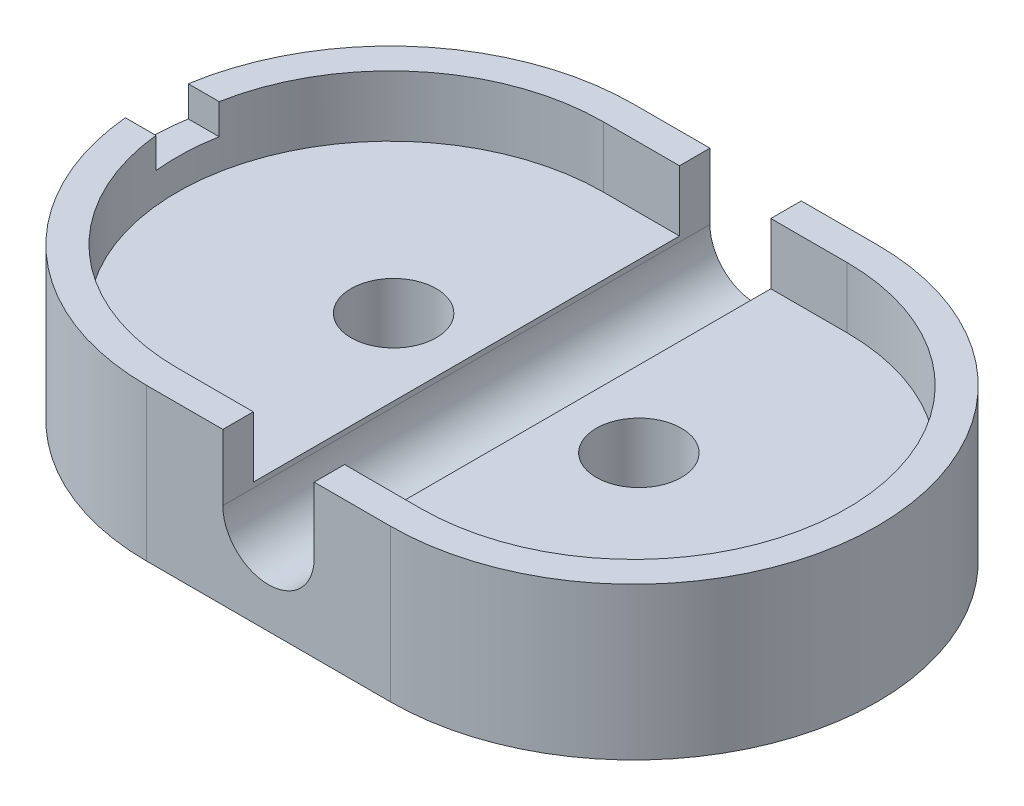
ISO-10303-21;
HEADER;
FILE_DESCRIPTION(('STEP AP214'),'2;1');
FILE_NAME('part.step','',(''),(''),'','','');
FILE_SCHEMA(('AUTOMOTIVE_DESIGN { 1 0 10303 214 1 1 1 1 }'));
ENDSEC;
DATA;
#1=APPLICATION_CONTEXT('core data for automotive mechanical design processes');
#2=APPLICATION_PROTOCOL_DEFINITION('international standard','automotive_design',2000,#1);
#3=PRODUCT_CONTEXT('',#1,'mechanical');
#4=PRODUCT('Part','Part','',(#3));
#5=PRODUCT_RELATED_PRODUCT_CATEGORY('part','',(#4));
#6=PRODUCT_DEFINITION_FORMATION('','',#4);
#7=PRODUCT_DEFINITION_CONTEXT('part definition',#1,'design');
#8=PRODUCT_DEFINITION('design','',#6,#7);
#9=PRODUCT_DEFINITION_SHAPE('','',#8);
#10=(LENGTH_UNIT() NAMED_UNIT(*) SI_UNIT(.MILLI.,.METRE.));
#11=(NAMED_UNIT(*) PLANE_ANGLE_UNIT() SI_UNIT($,.RADIAN.));
#12=(NAMED_UNIT(*) SI_UNIT($,.STERADIAN.) SOLID_ANGLE_UNIT());
#13=UNCERTAINTY_MEASURE_WITH_UNIT(LENGTH_MEASURE(1.E-05),#10,'distance_accuracy_value','');
#14=(GEOMETRIC_REPRESENTATION_CONTEXT(3) GLOBAL_UNCERTAINTY_ASSIGNED_CONTEXT((#13)) GLOBAL_UNIT_ASSIGNED_CONTEXT((#10,
#11,#12)) REPRESENTATION_CONTEXT('',''));
#15=CARTESIAN_POINT('',(0.,0.,0.));
#16=DIRECTION('',(0.,0.,1.));
#17=DIRECTION('',(1.,0.,0.));
#18=AXIS2_PLACEMENT_3D('',#15,#16,#17);
#19=CARTESIAN_POINT('',(0.,25.,-40.));
#20=DIRECTION('',(0.,1.,0.));
#21=DIRECTION('',(0.,0.,1.));
#22=AXIS2_PLACEMENT_3D('',#19,#20,#21);
#23=PLANE('',#22);
#24=DIRECTION('',(1.,0.,0.));
#25=VECTOR('',#24,1.);
#26=CARTESIAN_POINT('',(-40.,25.,-46.3231162941203));
#27=LINE('',#26,#25);
#28=CARTESIAN_POINT('',(-39.4970657179876,25.,-46.3231162941203));
#29=VERTEX_POINT('',#28);
#30=CARTESIAN_POINT('',(-34.4240933116768,25.,-46.3231162941203));
#31=VERTEX_POINT('',#30);
#32=EDGE_CURVE('E181',#29,#31,#27,.T.);
#33=ORIENTED_EDGE('',*,*,#32,.T.);
#34=CARTESIAN_POINT('',(0.,25.,-40.));
#35=DIRECTION('',(0.,1.,0.));
#36=DIRECTION('',(0.,0.,1.));
#37=AXIS2_PLACEMENT_3D('',#34,#35,#36);
#38=CIRCLE('',#37,35.);
#39=CARTESIAN_POINT('',(0.,25.,-75.));
#40=VERTEX_POINT('',#39);
#41=EDGE_CURVE('E296',#40,#31,#38,.T.);
#42=ORIENTED_EDGE('',*,*,#41,.F.);
#43=DIRECTION('',(-1.,0.,0.));
#44=VECTOR('',#43,1.);
#45=CARTESIAN_POINT('',(12.5,25.,-75.));
#46=LINE('',#45,#44);
#47=CARTESIAN_POINT('',(12.5,25.,-75.));
#48=VERTEX_POINT('',#47);
#49=EDGE_CURVE('E275',#48,#40,#46,.T.);
#50=ORIENTED_EDGE('',*,*,#49,.F.);
#51=DIRECTION('',(0.,0.,1.));
#52=VECTOR('',#51,1.);
#53=CARTESIAN_POINT('',(12.5,25.,-80.));
#54=LINE('',#53,#52);
#55=CARTESIAN_POINT('',(12.5,25.,-80.));
#56=VERTEX_POINT('',#55);
#57=EDGE_CURVE('E206',#56,#48,#54,.T.);
#58=ORIENTED_EDGE('',*,*,#57,.F.);
#59=DIRECTION('',(-1.,0.,0.));
#60=VECTOR('',#59,1.);
#61=CARTESIAN_POINT('',(40.,25.,-80.));
#62=LINE('',#61,#60);
#63=CARTESIAN_POINT('',(0.,25.,-80.));
#64=VERTEX_POINT('',#63);
#65=EDGE_CURVE('E212',#56,#64,#62,.T.);
#66=ORIENTED_EDGE('',*,*,#65,.T.);
#67=CARTESIAN_POINT('',(0.,25.,-40.));
#68=DIRECTION('',(0.,1.,0.));
#69=DIRECTION('',(0.,0.,1.));
#70=AXIS2_PLACEMENT_3D('',#67,#68,#69);
#71=CIRCLE('',#70,40.);
#72=EDGE_CURVE('E197',#64,#29,#71,.T.);
#73=ORIENTED_EDGE('',*,*,#72,.T.);
#74=EDGE_LOOP('',(#33,#42,#50,#58,#66,#73));
#75=FACE_BOUND('',#74,.T.);
#76=ADVANCED_FACE('F36',(#75),#23,.T.);
#77=DIRECTION('',(-1.,0.,0.));
#78=VECTOR('',#77,1.);
#79=CARTESIAN_POINT('',(27.5,25.,-75.));
#80=LINE('',#79,#78);
#81=CARTESIAN_POINT('',(40.,25.,-75.));
#82=VERTEX_POINT('',#81);
#83=CARTESIAN_POINT('',(27.5,25.,-75.));
#84=VERTEX_POINT('',#83);
#85=EDGE_CURVE('E259',#82,#84,#80,.T.);
#86=ORIENTED_EDGE('',*,*,#85,.F.);
#87=CARTESIAN_POINT('',(40.,25.,-40.));
#88=DIRECTION('',(0.,1.,0.));
#89=DIRECTION('',(0.,0.,-1.));
#90=AXIS2_PLACEMENT_3D('',#87,#88,#89);
#91=CIRCLE('',#90,35.);
#92=CARTESIAN_POINT('',(40.,25.,-4.99999999999999));
#93=VERTEX_POINT('',#92);
#94=EDGE_CURVE('E268',#93,#82,#91,.T.);
#95=ORIENTED_EDGE('',*,*,#94,.F.);
#96=DIRECTION('',(1.,0.,0.));
#97=VECTOR('',#96,1.);
#98=CARTESIAN_POINT('',(40.,25.,-5.));
#99=LINE('',#98,#97);
#100=CARTESIAN_POINT('',(27.5,25.,-5.));
#101=VERTEX_POINT('',#100);
#102=EDGE_CURVE('E255',#101,#93,#99,.T.);
#103=ORIENTED_EDGE('',*,*,#102,.F.);
#104=DIRECTION('',(0.,0.,1.));
#105=VECTOR('',#104,1.);
#106=CARTESIAN_POINT('',(27.5,25.,-80.));
#107=LINE('',#106,#105);
#108=CARTESIAN_POINT('',(27.5,25.,0.));
#109=VERTEX_POINT('',#108);
#110=EDGE_CURVE('E329',#101,#109,#107,.T.);
#111=ORIENTED_EDGE('',*,*,#110,.T.);
#112=DIRECTION('',(1.,0.,0.));
#113=VECTOR('',#112,1.);
#114=CARTESIAN_POINT('',(0.,25.,0.));
#115=LINE('',#114,#113);
#116=CARTESIAN_POINT('',(40.,25.,0.));
#117=VERTEX_POINT('',#116);
#118=EDGE_CURVE('E201',#109,#117,#115,.T.);
#119=ORIENTED_EDGE('',*,*,#118,.T.);
#120=CARTESIAN_POINT('',(40.,25.,-40.));
#121=DIRECTION('',(0.,1.,0.));
#122=DIRECTION('',(0.,0.,1.));
#123=AXIS2_PLACEMENT_3D('',#120,#121,#122);
#124=CIRCLE('',#123,40.);
#125=CARTESIAN_POINT('',(40.,25.,-80.));
#126=VERTEX_POINT('',#125);
#127=EDGE_CURVE('E210',#117,#126,#124,.T.);
#128=ORIENTED_EDGE('',*,*,#127,.T.);
#129=CARTESIAN_POINT('',(27.5,25.,-80.));
#130=VERTEX_POINT('',#129);
#131=EDGE_CURVE('E213',#126,#130,#62,.T.);
#132=ORIENTED_EDGE('',*,*,#131,.T.);
#133=EDGE_CURVE('E220',#130,#84,#107,.T.);
#134=ORIENTED_EDGE('',*,*,#133,.T.);
#135=EDGE_LOOP('',(#86,#95,#103,#111,#119,#128,#132,#134));
#136=FACE_BOUND('',#135,.T.);
#137=ADVANCED_FACE('F379',(#136),#23,.T.);
#138=CARTESIAN_POINT('',(0.,25.,-40.));
#139=DIRECTION('',(0.,-1.,0.));
#140=DIRECTION('',(0.,0.,-1.));
#141=AXIS2_PLACEMENT_3D('',#138,#139,#140);
#142=CYLINDRICAL_SURFACE('',#141,40.);
#143=DIRECTION('',(0.,-1.,0.));
#144=VECTOR('',#143,1.);
#145=CARTESIAN_POINT('',(-39.8306480767441,25.,-36.3231162941203));
#146=LINE('',#145,#144);
#147=CARTESIAN_POINT('',(-39.8306480767441,25.,-36.3231162941203));
#148=VERTEX_POINT('',#147);
#149=CARTESIAN_POINT('',(-39.8306480767441,20.,-36.3231162941203));
#150=VERTEX_POINT('',#149);
#151=EDGE_CURVE('E174',#148,#150,#146,.T.);
#152=ORIENTED_EDGE('',*,*,#151,.T.);
#153=CARTESIAN_POINT('',(0.,20.,-40.));
#154=DIRECTION('',(0.,-1.,0.));
#155=DIRECTION('',(0.,0.,-1.));
#156=AXIS2_PLACEMENT_3D('',#153,#154,#155);
#157=CIRCLE('',#156,40.);
#158=CARTESIAN_POINT('',(-39.4970657179876,20.,-46.3231162941203));
#159=VERTEX_POINT('',#158);
#160=EDGE_CURVE('E180',#150,#159,#157,.T.);
#161=ORIENTED_EDGE('',*,*,#160,.T.);
#162=DIRECTION('',(0.,-1.,0.));
#163=VECTOR('',#162,1.);
#164=CARTESIAN_POINT('',(-39.4970657179876,25.,-46.3231162941203));
#165=LINE('',#164,#163);
#166=EDGE_CURVE('E247',#159,#29,#165,.F.);
#167=ORIENTED_EDGE('',*,*,#166,.T.);
#168=ORIENTED_EDGE('',*,*,#72,.F.);
#169=DIRECTION('',(0.,-1.,0.));
#170=VECTOR('',#169,1.);
#171=CARTESIAN_POINT('',(0.,25.,-80.));
#172=LINE('',#171,#170);
#173=CARTESIAN_POINT('',(0.,0.,-80.));
#174=VERTEX_POINT('',#173);
#175=EDGE_CURVE('E216',#64,#174,#172,.T.);
#176=ORIENTED_EDGE('',*,*,#175,.T.);
#177=CARTESIAN_POINT('',(0.,0.,-40.));
#178=DIRECTION('',(0.,1.,0.));
#179=DIRECTION('',(0.,0.,1.));
#180=AXIS2_PLACEMENT_3D('',#177,#178,#179);
#181=CIRCLE('',#180,40.);
#182=CARTESIAN_POINT('',(0.,0.,0.));
#183=VERTEX_POINT('',#182);
#184=EDGE_CURVE('E217',#174,#183,#181,.T.);
#185=ORIENTED_EDGE('',*,*,#184,.T.);
#186=DIRECTION('',(0.,-1.,0.));
#187=VECTOR('',#186,1.);
#188=CARTESIAN_POINT('',(0.,25.,0.));
#189=LINE('',#188,#187);
#190=CARTESIAN_POINT('',(0.,25.,0.));
#191=VERTEX_POINT('',#190);
#192=EDGE_CURVE('E196',#191,#183,#189,.T.);
#193=ORIENTED_EDGE('',*,*,#192,.F.);
#194=EDGE_CURVE('E187',#148,#191,#71,.T.);
#195=ORIENTED_EDGE('',*,*,#194,.F.);
#196=EDGE_LOOP('',(#152,#161,#167,#168,#176,#185,#193,#195));
#197=FACE_BOUND('',#196,.T.);
#198=ADVANCED_FACE('F38',(#197),#142,.T.);
#199=CARTESIAN_POINT('',(0.,25.,0.));
#200=DIRECTION('',(0.,0.,-1.));
#201=DIRECTION('',(-1.,0.,0.));
#202=AXIS2_PLACEMENT_3D('',#199,#200,#201);
#203=PLANE('',#202);
#204=ORIENTED_EDGE('',*,*,#118,.F.);
#205=DIRECTION('',(0.,1.,0.));
#206=VECTOR('',#205,1.);
#207=CARTESIAN_POINT('',(27.5,14.1545976676462,0.));
#208=LINE('',#207,#206);
#209=CARTESIAN_POINT('',(27.5,14.1545976676462,0.));
#210=VERTEX_POINT('',#209);
#211=EDGE_CURVE('E313',#210,#109,#208,.T.);
#212=ORIENTED_EDGE('',*,*,#211,.F.);
#213=CARTESIAN_POINT('',(20.,14.1545976676462,0.));
#214=DIRECTION('',(0.,0.,1.));
#215=DIRECTION('',(1.,0.,0.));
#216=AXIS2_PLACEMENT_3D('',#213,#214,#215);
#217=CIRCLE('',#216,7.5);
#218=CARTESIAN_POINT('',(12.5,14.1545976676462,0.));
#219=VERTEX_POINT('',#218);
#220=EDGE_CURVE('E322',#219,#210,#217,.T.);
#221=ORIENTED_EDGE('',*,*,#220,.F.);
#222=DIRECTION('',(0.,-1.,0.));
#223=VECTOR('',#222,1.);
#224=CARTESIAN_POINT('',(12.5,25.,0.));
#225=LINE('',#224,#223);
#226=CARTESIAN_POINT('',(12.5,25.,0.));
#227=VERTEX_POINT('',#226);
#228=EDGE_CURVE('E302',#227,#219,#225,.T.);
#229=ORIENTED_EDGE('',*,*,#228,.F.);
#230=EDGE_CURVE('E208',#191,#227,#115,.T.);
#231=ORIENTED_EDGE('',*,*,#230,.F.);
#232=ORIENTED_EDGE('',*,*,#192,.T.);
#233=DIRECTION('',(1.,0.,0.));
#234=VECTOR('',#233,1.);
#235=CARTESIAN_POINT('',(0.,0.,0.));
#236=LINE('',#235,#234);
#237=CARTESIAN_POINT('',(40.,0.,0.));
#238=VERTEX_POINT('',#237);
#239=EDGE_CURVE('E219',#183,#238,#236,.T.);
#240=ORIENTED_EDGE('',*,*,#239,.T.);
#241=DIRECTION('',(0.,-1.,0.));
#242=VECTOR('',#241,1.);
#243=CARTESIAN_POINT('',(40.,25.,0.));
#244=LINE('',#243,#242);
#245=EDGE_CURVE('E228',#117,#238,#244,.T.);
#246=ORIENTED_EDGE('',*,*,#245,.F.);
#247=EDGE_LOOP('',(#204,#212,#221,#229,#231,#232,#240,#246));
#248=FACE_BOUND('',#247,.T.);
#249=ADVANCED_FACE('F346',(#248),#203,.F.);
#250=CARTESIAN_POINT('',(40.,25.,-40.));
#251=DIRECTION('',(0.,-1.,0.));
#252=DIRECTION('',(0.,0.,-1.));
#253=AXIS2_PLACEMENT_3D('',#250,#251,#252);
#254=CYLINDRICAL_SURFACE('',#253,40.);
#255=CARTESIAN_POINT('',(40.,0.,-40.));
#256=DIRECTION('',(0.,1.,0.));
#257=DIRECTION('',(0.,0.,1.));
#258=AXIS2_PLACEMENT_3D('',#255,#256,#257);
#259=CIRCLE('',#258,40.);
#260=CARTESIAN_POINT('',(40.,0.,-80.));
#261=VERTEX_POINT('',#260);
#262=EDGE_CURVE('E202',#238,#261,#259,.T.);
#263=ORIENTED_EDGE('',*,*,#262,.T.);
#264=DIRECTION('',(0.,-1.,0.));
#265=VECTOR('',#264,1.);
#266=CARTESIAN_POINT('',(40.,25.,-80.));
#267=LINE('',#266,#265);
#268=EDGE_CURVE('E225',#126,#261,#267,.T.);
#269=ORIENTED_EDGE('',*,*,#268,.F.);
#270=ORIENTED_EDGE('',*,*,#127,.F.);
#271=ORIENTED_EDGE('',*,*,#245,.T.);
#272=EDGE_LOOP('',(#263,#269,#270,#271));
#273=FACE_BOUND('',#272,.T.);
#274=ADVANCED_FACE('F393',(#273),#254,.T.);
#275=CARTESIAN_POINT('',(40.,25.,-80.));
#276=DIRECTION('',(0.,0.,1.));
#277=DIRECTION('',(1.,0.,0.));
#278=AXIS2_PLACEMENT_3D('',#275,#276,#277);
#279=PLANE('',#278);
#280=CARTESIAN_POINT('',(20.,14.1545976676462,-80.));
#281=DIRECTION('',(0.,0.,1.));
#282=DIRECTION('',(1.,0.,0.));
#283=AXIS2_PLACEMENT_3D('',#280,#281,#282);
#284=CIRCLE('',#283,7.5);
#285=CARTESIAN_POINT('',(12.5,14.1545976676462,-80.));
#286=VERTEX_POINT('',#285);
#287=CARTESIAN_POINT('',(27.5,14.1545976676462,-80.));
#288=VERTEX_POINT('',#287);
#289=EDGE_CURVE('E312',#286,#288,#284,.T.);
#290=ORIENTED_EDGE('',*,*,#289,.T.);
#291=DIRECTION('',(0.,1.,0.));
#292=VECTOR('',#291,1.);
#293=CARTESIAN_POINT('',(27.5,14.1545976676462,-80.));
#294=LINE('',#293,#292);
#295=EDGE_CURVE('E316',#288,#130,#294,.T.);
#296=ORIENTED_EDGE('',*,*,#295,.T.);
#297=ORIENTED_EDGE('',*,*,#131,.F.);
#298=ORIENTED_EDGE('',*,*,#268,.T.);
#299=DIRECTION('',(-1.,0.,0.));
#300=VECTOR('',#299,1.);
#301=CARTESIAN_POINT('',(40.,0.,-80.));
#302=LINE('',#301,#300);
#303=EDGE_CURVE('E198',#261,#174,#302,.T.);
#304=ORIENTED_EDGE('',*,*,#303,.T.);
#305=ORIENTED_EDGE('',*,*,#175,.F.);
#306=ORIENTED_EDGE('',*,*,#65,.F.);
#307=DIRECTION('',(0.,-1.,0.));
#308=VECTOR('',#307,1.);
#309=CARTESIAN_POINT('',(12.5,25.,-80.));
#310=LINE('',#309,#308);
#311=EDGE_CURVE('E309',#56,#286,#310,.T.);
#312=ORIENTED_EDGE('',*,*,#311,.T.);
#313=EDGE_LOOP('',(#290,#296,#297,#298,#304,#305,#306,#312));
#314=FACE_BOUND('',#313,.T.);
#315=ADVANCED_FACE('F355',(#314),#279,.F.);
#316=DIRECTION('',(1.,0.,0.));
#317=VECTOR('',#316,1.);
#318=CARTESIAN_POINT('',(-40.,25.,-36.3231162941203));
#319=LINE('',#318,#317);
#320=CARTESIAN_POINT('',(-34.8063288241296,25.,-36.3231162941203));
#321=VERTEX_POINT('',#320);
#322=EDGE_CURVE('E51',#148,#321,#319,.T.);
#323=ORIENTED_EDGE('',*,*,#322,.F.);
#324=ORIENTED_EDGE('',*,*,#194,.T.);
#325=ORIENTED_EDGE('',*,*,#230,.T.);
#326=CARTESIAN_POINT('',(12.5,25.,-5.));
#327=VERTEX_POINT('',#326);
#328=EDGE_CURVE('E319',#327,#227,#54,.T.);
#329=ORIENTED_EDGE('',*,*,#328,.F.);
#330=DIRECTION('',(1.,0.,0.));
#331=VECTOR('',#330,1.);
#332=CARTESIAN_POINT('',(0.,25.,-5.));
#333=LINE('',#332,#331);
#334=CARTESIAN_POINT('',(0.,25.,-4.99999999999999));
#335=VERTEX_POINT('',#334);
#336=EDGE_CURVE('E285',#335,#327,#333,.T.);
#337=ORIENTED_EDGE('',*,*,#336,.F.);
#338=EDGE_CURVE('E190',#321,#335,#38,.T.);
#339=ORIENTED_EDGE('',*,*,#338,.F.);
#340=EDGE_LOOP('',(#323,#324,#325,#329,#337,#339));
#341=FACE_BOUND('',#340,.T.);
#342=ADVANCED_FACE('F185',(#341),#23,.T.);
#343=CARTESIAN_POINT('',(0.,0.,-40.));
#344=DIRECTION('',(0.,1.,0.));
#345=DIRECTION('',(0.,0.,1.));
#346=AXIS2_PLACEMENT_3D('',#343,#344,#345);
#347=PLANE('',#346);
#348=CARTESIAN_POINT('',(40.,0.,-40.827298833823));
#349=DIRECTION('',(0.,1.,0.));
#350=DIRECTION('',(0.,0.,1.));
#351=AXIS2_PLACEMENT_3D('',#348,#349,#350);
#352=CIRCLE('',#351,7.);
#353=CARTESIAN_POINT('',(40.,0.,-33.827298833823));
#354=VERTEX_POINT('',#353);
#355=EDGE_CURVE('E580',#354,#354,#352,.T.);
#356=ORIENTED_EDGE('',*,*,#355,.T.);
#357=EDGE_LOOP('',(#356));
#358=FACE_BOUND('',#357,.T.);
#359=CARTESIAN_POINT('',(0.,0.,-40.551532555882));
#360=DIRECTION('',(0.,1.,0.));
#361=DIRECTION('',(0.,0.,1.));
#362=AXIS2_PLACEMENT_3D('',#359,#360,#361);
#363=CIRCLE('',#362,7.);
#364=CARTESIAN_POINT('',(0.,0.,-33.551532555882));
#365=VERTEX_POINT('',#364);
#366=EDGE_CURVE('E191',#365,#365,#363,.T.);
#367=ORIENTED_EDGE('',*,*,#366,.T.);
#368=EDGE_LOOP('',(#367));
#369=FACE_BOUND('',#368,.T.);
#370=ORIENTED_EDGE('',*,*,#184,.F.);
#371=ORIENTED_EDGE('',*,*,#303,.F.);
#372=ORIENTED_EDGE('',*,*,#262,.F.);
#373=ORIENTED_EDGE('',*,*,#239,.F.);
#374=EDGE_LOOP('',(#370,#371,#372,#373));
#375=FACE_BOUND('',#374,.T.);
#376=ADVANCED_FACE('F387',(#358,#369,#375),#347,.F.);
#377=CARTESIAN_POINT('',(27.5,14.1545976676462,-80.));
#378=DIRECTION('',(1.,0.,0.));
#379=DIRECTION('',(0.,0.,-1.));
#380=AXIS2_PLACEMENT_3D('',#377,#378,#379);
#381=PLANE('',#380);
#382=DIRECTION('',(0.,0.,1.));
#383=VECTOR('',#382,1.);
#384=CARTESIAN_POINT('',(27.5,15.,-5.));
#385=LINE('',#384,#383);
#386=CARTESIAN_POINT('',(27.5,15.,-75.));
#387=VERTEX_POINT('',#386);
#388=CARTESIAN_POINT('',(27.5,15.,-5.));
#389=VERTEX_POINT('',#388);
#390=EDGE_CURVE('E256',#387,#389,#385,.T.);
#391=ORIENTED_EDGE('',*,*,#390,.F.);
#392=DIRECTION('',(0.,1.,0.));
#393=VECTOR('',#392,1.);
#394=CARTESIAN_POINT('',(27.5,15.,-75.));
#395=LINE('',#394,#393);
#396=EDGE_CURVE('E272',#387,#84,#395,.T.);
#397=ORIENTED_EDGE('',*,*,#396,.T.);
#398=ORIENTED_EDGE('',*,*,#133,.F.);
#399=ORIENTED_EDGE('',*,*,#295,.F.);
#400=DIRECTION('',(0.,0.,1.));
#401=VECTOR('',#400,1.);
#402=CARTESIAN_POINT('',(27.5,14.1545976676462,-80.));
#403=LINE('',#402,#401);
#404=EDGE_CURVE('E330',#288,#210,#403,.T.);
#405=ORIENTED_EDGE('',*,*,#404,.T.);
#406=ORIENTED_EDGE('',*,*,#211,.T.);
#407=ORIENTED_EDGE('',*,*,#110,.F.);
#408=DIRECTION('',(0.,1.,0.));
#409=VECTOR('',#408,1.);
#410=CARTESIAN_POINT('',(27.5,15.,-5.));
#411=LINE('',#410,#409);
#412=EDGE_CURVE('E265',#389,#101,#411,.T.);
#413=ORIENTED_EDGE('',*,*,#412,.F.);
#414=EDGE_LOOP('',(#391,#397,#398,#399,#405,#406,#407,#413));
#415=FACE_BOUND('',#414,.T.);
#416=ADVANCED_FACE('F352',(#415),#381,.F.);
#417=CARTESIAN_POINT('',(20.,14.1545976676462,-80.));
#418=DIRECTION('',(0.,0.,1.));
#419=DIRECTION('',(1.,0.,0.));
#420=AXIS2_PLACEMENT_3D('',#417,#418,#419);
#421=CYLINDRICAL_SURFACE('',#420,7.5);
#422=ORIENTED_EDGE('',*,*,#220,.T.);
#423=ORIENTED_EDGE('',*,*,#404,.F.);
#424=ORIENTED_EDGE('',*,*,#289,.F.);
#425=DIRECTION('',(0.,0.,1.));
#426=VECTOR('',#425,1.);
#427=CARTESIAN_POINT('',(12.5,14.1545976676462,-80.));
#428=LINE('',#427,#426);
#429=EDGE_CURVE('E331',#286,#219,#428,.T.);
#430=ORIENTED_EDGE('',*,*,#429,.T.);
#431=EDGE_LOOP('',(#422,#423,#424,#430));
#432=FACE_BOUND('',#431,.T.);
#433=ADVANCED_FACE('F348',(#432),#421,.F.);
#434=CARTESIAN_POINT('',(12.5,25.,-80.));
#435=DIRECTION('',(-1.,0.,0.));
#436=DIRECTION('',(0.,-1.,0.));
#437=AXIS2_PLACEMENT_3D('',#434,#435,#436);
#438=PLANE('',#437);
#439=DIRECTION('',(0.,0.,-1.));
#440=VECTOR('',#439,1.);
#441=CARTESIAN_POINT('',(12.5,15.,-5.));
#442=LINE('',#441,#440);
#443=CARTESIAN_POINT('',(12.5,15.,-4.99999999999999));
#444=VERTEX_POINT('',#443);
#445=CARTESIAN_POINT('',(12.5,15.,-75.));
#446=VERTEX_POINT('',#445);
#447=EDGE_CURVE('E281',#444,#446,#442,.T.);
#448=ORIENTED_EDGE('',*,*,#447,.F.);
#449=DIRECTION('',(0.,1.,0.));
#450=VECTOR('',#449,1.);
#451=CARTESIAN_POINT('',(12.5,15.,-5.));
#452=LINE('',#451,#450);
#453=EDGE_CURVE('E299',#444,#327,#452,.T.);
#454=ORIENTED_EDGE('',*,*,#453,.T.);
#455=ORIENTED_EDGE('',*,*,#328,.T.);
#456=ORIENTED_EDGE('',*,*,#228,.T.);
#457=ORIENTED_EDGE('',*,*,#429,.F.);
#458=ORIENTED_EDGE('',*,*,#311,.F.);
#459=ORIENTED_EDGE('',*,*,#57,.T.);
#460=DIRECTION('',(0.,1.,0.));
#461=VECTOR('',#460,1.);
#462=CARTESIAN_POINT('',(12.5,15.,-75.));
#463=LINE('',#462,#461);
#464=EDGE_CURVE('E293',#446,#48,#463,.T.);
#465=ORIENTED_EDGE('',*,*,#464,.F.);
#466=EDGE_LOOP('',(#448,#454,#455,#456,#457,#458,#459,#465));
#467=FACE_BOUND('',#466,.T.);
#468=ADVANCED_FACE('F341',(#467),#438,.F.);
#469=CARTESIAN_POINT('',(0.,15.,-5.));
#470=DIRECTION('',(0.,0.,1.));
#471=DIRECTION('',(1.,0.,0.));
#472=AXIS2_PLACEMENT_3D('',#469,#470,#471);
#473=PLANE('',#472);
#474=ORIENTED_EDGE('',*,*,#336,.T.);
#475=ORIENTED_EDGE('',*,*,#453,.F.);
#476=DIRECTION('',(1.,0.,0.));
#477=VECTOR('',#476,1.);
#478=CARTESIAN_POINT('',(0.,15.,-5.));
#479=LINE('',#478,#477);
#480=CARTESIAN_POINT('',(0.,15.,-4.99999999999999));
#481=VERTEX_POINT('',#480);
#482=EDGE_CURVE('E291',#481,#444,#479,.T.);
#483=ORIENTED_EDGE('',*,*,#482,.F.);
#484=DIRECTION('',(0.,1.,0.));
#485=VECTOR('',#484,1.);
#486=CARTESIAN_POINT('',(0.,15.,-4.99999999999999));
#487=LINE('',#486,#485);
#488=EDGE_CURVE('E303',#481,#335,#487,.T.);
#489=ORIENTED_EDGE('',*,*,#488,.T.);
#490=EDGE_LOOP('',(#474,#475,#483,#489));
#491=FACE_BOUND('',#490,.T.);
#492=ADVANCED_FACE('F368',(#491),#473,.F.);
#493=CARTESIAN_POINT('',(0.,15.,-40.));
#494=DIRECTION('',(0.,1.,0.));
#495=DIRECTION('',(0.,0.,1.));
#496=AXIS2_PLACEMENT_3D('',#493,#494,#495);
#497=CYLINDRICAL_SURFACE('',#496,35.);
#498=ORIENTED_EDGE('',*,*,#41,.T.);
#499=DIRECTION('',(0.,1.,0.));
#500=VECTOR('',#499,1.);
#501=CARTESIAN_POINT('',(-34.4240933116768,15.,-46.3231162941203));
#502=LINE('',#501,#500);
#503=CARTESIAN_POINT('',(-34.4240933116768,20.,-46.3231162941203));
#504=VERTEX_POINT('',#503);
#505=EDGE_CURVE('E11',#31,#504,#502,.F.);
#506=ORIENTED_EDGE('',*,*,#505,.T.);
#507=CARTESIAN_POINT('',(0.,20.,-40.));
#508=DIRECTION('',(0.,-1.,0.));
#509=DIRECTION('',(0.,0.,-1.));
#510=AXIS2_PLACEMENT_3D('',#507,#508,#509);
#511=CIRCLE('',#510,35.);
#512=CARTESIAN_POINT('',(-34.8063288241296,20.,-36.3231162941203));
#513=VERTEX_POINT('',#512);
#514=EDGE_CURVE('E44',#504,#513,#511,.F.);
#515=ORIENTED_EDGE('',*,*,#514,.T.);
#516=DIRECTION('',(0.,1.,0.));
#517=VECTOR('',#516,1.);
#518=CARTESIAN_POINT('',(-34.8063288241296,15.,-36.3231162941203));
#519=LINE('',#518,#517);
#520=EDGE_CURVE('E232',#513,#321,#519,.T.);
#521=ORIENTED_EDGE('',*,*,#520,.T.);
#522=ORIENTED_EDGE('',*,*,#338,.T.);
#523=ORIENTED_EDGE('',*,*,#488,.F.);
#524=CARTESIAN_POINT('',(0.,15.,-40.));
#525=DIRECTION('',(0.,1.,0.));
#526=DIRECTION('',(0.,0.,1.));
#527=AXIS2_PLACEMENT_3D('',#524,#525,#526);
#528=CIRCLE('',#527,35.);
#529=CARTESIAN_POINT('',(0.,15.,-75.));
#530=VERTEX_POINT('',#529);
#531=EDGE_CURVE('E288',#530,#481,#528,.T.);
#532=ORIENTED_EDGE('',*,*,#531,.F.);
#533=DIRECTION('',(0.,1.,0.));
#534=VECTOR('',#533,1.);
#535=CARTESIAN_POINT('',(0.,15.,-75.));
#536=LINE('',#535,#534);
#537=EDGE_CURVE('E306',#530,#40,#536,.T.);
#538=ORIENTED_EDGE('',*,*,#537,.T.);
#539=EDGE_LOOP('',(#498,#506,#515,#521,#522,#523,#532,#538));
#540=FACE_BOUND('',#539,.T.);
#541=ADVANCED_FACE('F236',(#540),#497,.F.);
#542=CARTESIAN_POINT('',(12.5,15.,-75.));
#543=DIRECTION('',(0.,0.,-1.));
#544=DIRECTION('',(-1.,0.,0.));
#545=AXIS2_PLACEMENT_3D('',#542,#543,#544);
#546=PLANE('',#545);
#547=ORIENTED_EDGE('',*,*,#49,.T.);
#548=ORIENTED_EDGE('',*,*,#537,.F.);
#549=DIRECTION('',(-1.,0.,0.));
#550=VECTOR('',#549,1.);
#551=CARTESIAN_POINT('',(12.5,15.,-75.));
#552=LINE('',#551,#550);
#553=EDGE_CURVE('E284',#446,#530,#552,.T.);
#554=ORIENTED_EDGE('',*,*,#553,.F.);
#555=ORIENTED_EDGE('',*,*,#464,.T.);
#556=EDGE_LOOP('',(#547,#548,#554,#555));
#557=FACE_BOUND('',#556,.T.);
#558=ADVANCED_FACE('F362',(#557),#546,.F.);
#559=CARTESIAN_POINT('',(0.,15.,-40.));
#560=DIRECTION('',(0.,1.,0.));
#561=DIRECTION('',(0.,0.,1.));
#562=AXIS2_PLACEMENT_3D('',#559,#560,#561);
#563=PLANE('',#562);
#564=CARTESIAN_POINT('',(0.,15.,-40.551532555882));
#565=DIRECTION('',(0.,1.,0.));
#566=DIRECTION('',(0.,0.,1.));
#567=AXIS2_PLACEMENT_3D('',#564,#565,#566);
#568=CIRCLE('',#567,7.);
#569=CARTESIAN_POINT('',(0.,15.,-33.551532555882));
#570=VERTEX_POINT('',#569);
#571=EDGE_CURVE('E578',#570,#570,#568,.T.);
#572=ORIENTED_EDGE('',*,*,#571,.F.);
#573=EDGE_LOOP('',(#572));
#574=FACE_BOUND('',#573,.T.);
#575=ORIENTED_EDGE('',*,*,#447,.T.);
#576=ORIENTED_EDGE('',*,*,#553,.T.);
#577=ORIENTED_EDGE('',*,*,#531,.T.);
#578=ORIENTED_EDGE('',*,*,#482,.T.);
#579=EDGE_LOOP('',(#575,#576,#577,#578));
#580=FACE_BOUND('',#579,.T.);
#581=ADVANCED_FACE('F365',(#574,#580),#563,.T.);
#582=CARTESIAN_POINT('',(27.5,15.,-75.));
#583=DIRECTION('',(0.,0.,-1.));
#584=DIRECTION('',(-1.,0.,0.));
#585=AXIS2_PLACEMENT_3D('',#582,#583,#584);
#586=PLANE('',#585);
#587=ORIENTED_EDGE('',*,*,#85,.T.);
#588=ORIENTED_EDGE('',*,*,#396,.F.);
#589=DIRECTION('',(-1.,0.,0.));
#590=VECTOR('',#589,1.);
#591=CARTESIAN_POINT('',(27.5,15.,-75.));
#592=LINE('',#591,#590);
#593=CARTESIAN_POINT('',(40.,15.,-75.));
#594=VERTEX_POINT('',#593);
#595=EDGE_CURVE('E59',#594,#387,#592,.T.);
#596=ORIENTED_EDGE('',*,*,#595,.F.);
#597=DIRECTION('',(0.,1.,0.));
#598=VECTOR('',#597,1.);
#599=CARTESIAN_POINT('',(40.,15.,-75.));
#600=LINE('',#599,#598);
#601=EDGE_CURVE('E276',#594,#82,#600,.T.);
#602=ORIENTED_EDGE('',*,*,#601,.T.);
#603=EDGE_LOOP('',(#587,#588,#596,#602));
#604=FACE_BOUND('',#603,.T.);
#605=ADVANCED_FACE('F430',(#604),#586,.F.);
#606=CARTESIAN_POINT('',(40.,15.,-40.));
#607=DIRECTION('',(0.,1.,0.));
#608=DIRECTION('',(0.,0.,1.));
#609=AXIS2_PLACEMENT_3D('',#606,#607,#608);
#610=CYLINDRICAL_SURFACE('',#609,35.);
#611=ORIENTED_EDGE('',*,*,#94,.T.);
#612=ORIENTED_EDGE('',*,*,#601,.F.);
#613=CARTESIAN_POINT('',(40.,15.,-40.));
#614=DIRECTION('',(0.,1.,0.));
#615=DIRECTION('',(0.,0.,-1.));
#616=AXIS2_PLACEMENT_3D('',#613,#614,#615);
#617=CIRCLE('',#616,35.);
#618=CARTESIAN_POINT('',(40.,15.,-4.99999999999999));
#619=VERTEX_POINT('',#618);
#620=EDGE_CURVE('E262',#619,#594,#617,.T.);
#621=ORIENTED_EDGE('',*,*,#620,.F.);
#622=DIRECTION('',(0.,1.,0.));
#623=VECTOR('',#622,1.);
#624=CARTESIAN_POINT('',(40.,15.,-4.99999999999999));
#625=LINE('',#624,#623);
#626=EDGE_CURVE('E278',#619,#93,#625,.T.);
#627=ORIENTED_EDGE('',*,*,#626,.T.);
#628=EDGE_LOOP('',(#611,#612,#621,#627));
#629=FACE_BOUND('',#628,.T.);
#630=ADVANCED_FACE('F435',(#629),#610,.F.);
#631=CARTESIAN_POINT('',(40.,15.,-5.));
#632=DIRECTION('',(0.,0.,1.));
#633=DIRECTION('',(1.,0.,0.));
#634=AXIS2_PLACEMENT_3D('',#631,#632,#633);
#635=PLANE('',#634);
#636=ORIENTED_EDGE('',*,*,#102,.T.);
#637=ORIENTED_EDGE('',*,*,#626,.F.);
#638=DIRECTION('',(1.,0.,0.));
#639=VECTOR('',#638,1.);
#640=CARTESIAN_POINT('',(40.,15.,-5.));
#641=LINE('',#640,#639);
#642=EDGE_CURVE('E258',#389,#619,#641,.T.);
#643=ORIENTED_EDGE('',*,*,#642,.F.);
#644=ORIENTED_EDGE('',*,*,#412,.T.);
#645=EDGE_LOOP('',(#636,#637,#643,#644));
#646=FACE_BOUND('',#645,.T.);
#647=ADVANCED_FACE('F447',(#646),#635,.F.);
#648=CARTESIAN_POINT('',(40.,15.,-40.));
#649=DIRECTION('',(0.,-1.,0.));
#650=DIRECTION('',(0.,0.,-1.));
#651=AXIS2_PLACEMENT_3D('',#648,#649,#650);
#652=PLANE('',#651);
#653=CARTESIAN_POINT('',(40.,15.,-40.827298833823));
#654=DIRECTION('',(0.,1.,0.));
#655=DIRECTION('',(0.,0.,1.));
#656=AXIS2_PLACEMENT_3D('',#653,#654,#655);
#657=CIRCLE('',#656,7.);
#658=CARTESIAN_POINT('',(40.,15.,-33.827298833823));
#659=VERTEX_POINT('',#658);
#660=EDGE_CURVE('E584',#659,#659,#657,.T.);
#661=ORIENTED_EDGE('',*,*,#660,.F.);
#662=EDGE_LOOP('',(#661));
#663=FACE_BOUND('',#662,.T.);
#664=ORIENTED_EDGE('',*,*,#390,.T.);
#665=ORIENTED_EDGE('',*,*,#642,.T.);
#666=ORIENTED_EDGE('',*,*,#620,.T.);
#667=ORIENTED_EDGE('',*,*,#595,.T.);
#668=EDGE_LOOP('',(#664,#665,#666,#667));
#669=FACE_BOUND('',#668,.T.);
#670=ADVANCED_FACE('F456',(#663,#669),#652,.F.);
#671=CARTESIAN_POINT('',(-40.,25.,-46.3231162941203));
#672=DIRECTION('',(0.,0.,-1.));
#673=DIRECTION('',(-1.,0.,0.));
#674=AXIS2_PLACEMENT_3D('',#671,#672,#673);
#675=PLANE('',#674);
#676=DIRECTION('',(1.,0.,0.));
#677=VECTOR('',#676,1.);
#678=CARTESIAN_POINT('',(-40.,20.,-46.3231162941203));
#679=LINE('',#678,#677);
#680=EDGE_CURVE('E241',#159,#504,#679,.T.);
#681=ORIENTED_EDGE('',*,*,#680,.T.);
#682=ORIENTED_EDGE('',*,*,#505,.F.);
#683=ORIENTED_EDGE('',*,*,#32,.F.);
#684=ORIENTED_EDGE('',*,*,#166,.F.);
#685=EDGE_LOOP('',(#681,#682,#683,#684));
#686=FACE_BOUND('',#685,.T.);
#687=ADVANCED_FACE('F244',(#686),#675,.F.);
#688=CARTESIAN_POINT('',(-40.,20.,-46.3231162941203));
#689=DIRECTION('',(0.,-1.,0.));
#690=DIRECTION('',(0.,0.,-1.));
#691=AXIS2_PLACEMENT_3D('',#688,#689,#690);
#692=PLANE('',#691);
#693=DIRECTION('',(1.,0.,0.));
#694=VECTOR('',#693,1.);
#695=CARTESIAN_POINT('',(-40.,20.,-36.3231162941203));
#696=LINE('',#695,#694);
#697=EDGE_CURVE('E177',#150,#513,#696,.T.);
#698=ORIENTED_EDGE('',*,*,#697,.T.);
#699=ORIENTED_EDGE('',*,*,#514,.F.);
#700=ORIENTED_EDGE('',*,*,#680,.F.);
#701=ORIENTED_EDGE('',*,*,#160,.F.);
#702=EDGE_LOOP('',(#698,#699,#700,#701));
#703=FACE_BOUND('',#702,.T.);
#704=ADVANCED_FACE('F240',(#703),#692,.F.);
#705=CARTESIAN_POINT('',(-40.,20.,-36.3231162941203));
#706=DIRECTION('',(0.,0.,1.));
#707=DIRECTION('',(1.,0.,0.));
#708=AXIS2_PLACEMENT_3D('',#705,#706,#707);
#709=PLANE('',#708);
#710=ORIENTED_EDGE('',*,*,#322,.T.);
#711=ORIENTED_EDGE('',*,*,#520,.F.);
#712=ORIENTED_EDGE('',*,*,#697,.F.);
#713=ORIENTED_EDGE('',*,*,#151,.F.);
#714=EDGE_LOOP('',(#710,#711,#712,#713));
#715=FACE_BOUND('',#714,.T.);
#716=ADVANCED_FACE('F175',(#715),#709,.F.);
#717=CARTESIAN_POINT('',(0.,0.,-40.551532555882));
#718=DIRECTION('',(0.,1.,0.));
#719=DIRECTION('',(0.,0.,1.));
#720=AXIS2_PLACEMENT_3D('',#717,#718,#719);
#721=CYLINDRICAL_SURFACE('',#720,7.);
#722=ORIENTED_EDGE('',*,*,#366,.F.);
#723=EDGE_LOOP('',(#722));
#724=FACE_BOUND('',#723,.T.);
#725=ORIENTED_EDGE('',*,*,#571,.T.);
#726=EDGE_LOOP('',(#725));
#727=FACE_BOUND('',#726,.T.);
#728=ADVANCED_FACE('F492',(#724,#727),#721,.F.);
#729=CARTESIAN_POINT('',(40.,0.,-40.827298833823));
#730=DIRECTION('',(0.,1.,0.));
#731=DIRECTION('',(0.,0.,1.));
#732=AXIS2_PLACEMENT_3D('',#729,#730,#731);
#733=CYLINDRICAL_SURFACE('',#732,7.);
#734=ORIENTED_EDGE('',*,*,#355,.F.);
#735=EDGE_LOOP('',(#734));
#736=FACE_BOUND('',#735,.T.);
#737=ORIENTED_EDGE('',*,*,#660,.T.);
#738=EDGE_LOOP('',(#737));
#739=FACE_BOUND('',#738,.T.);
#740=ADVANCED_FACE('F501',(#736,#739),#733,.F.);
#741=CLOSED_SHELL('',(#76,#137,#198,#249,#274,#315,#342,#376,#416,#433,#468,#492,#541,#558,#581,
#605,#630,#647,#670,#687,#704,#716,#728,#740));
#742=MANIFOLD_SOLID_BREP('B2',#741);
#743=ADVANCED_BREP_SHAPE_REPRESENTATION('',(#18,#742),#14);
#744=SHAPE_DEFINITION_REPRESENTATION(#9,#743);
ENDSEC;
END-ISO-10303-21;
